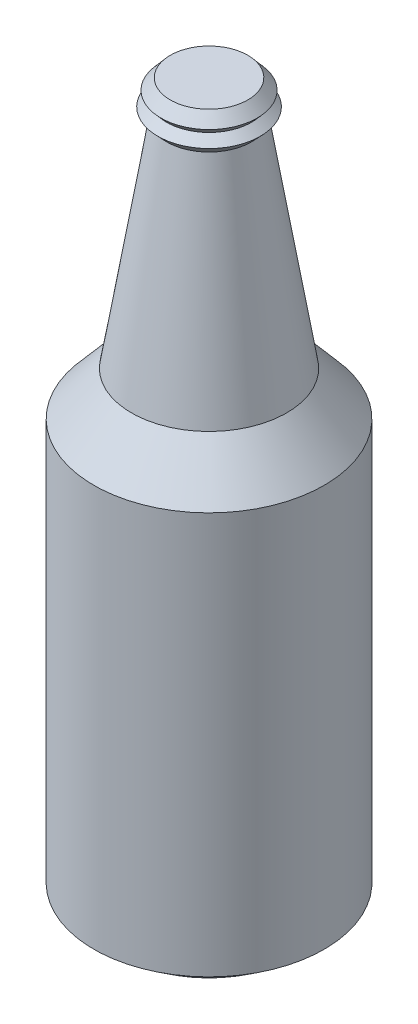
ISO-10303-21;
HEADER;
FILE_DESCRIPTION(('STEP AP214'),'2;1');
FILE_NAME('part.step','',(''),(''),'','','');
FILE_SCHEMA(('AUTOMOTIVE_DESIGN { 1 0 10303 214 1 1 1 1 }'));
ENDSEC;
DATA;
#1=APPLICATION_CONTEXT('core data for automotive mechanical design processes');
#2=APPLICATION_PROTOCOL_DEFINITION('international standard','automotive_design',2000,#1);
#3=PRODUCT_CONTEXT('',#1,'mechanical');
#4=PRODUCT('Part','Part','',(#3));
#5=PRODUCT_RELATED_PRODUCT_CATEGORY('part','',(#4));
#6=PRODUCT_DEFINITION_FORMATION('','',#4);
#7=PRODUCT_DEFINITION_CONTEXT('part definition',#1,'design');
#8=PRODUCT_DEFINITION('design','',#6,#7);
#9=PRODUCT_DEFINITION_SHAPE('','',#8);
#10=(LENGTH_UNIT() NAMED_UNIT(*) SI_UNIT(.MILLI.,.METRE.));
#11=(NAMED_UNIT(*) PLANE_ANGLE_UNIT() SI_UNIT($,.RADIAN.));
#12=(NAMED_UNIT(*) SI_UNIT($,.STERADIAN.) SOLID_ANGLE_UNIT());
#13=UNCERTAINTY_MEASURE_WITH_UNIT(LENGTH_MEASURE(1.E-05),#10,'distance_accuracy_value','');
#14=(GEOMETRIC_REPRESENTATION_CONTEXT(3) GLOBAL_UNCERTAINTY_ASSIGNED_CONTEXT((#13)) GLOBAL_UNIT_ASSIGNED_CONTEXT((#10,
#11,#12)) REPRESENTATION_CONTEXT('',''));
#15=CARTESIAN_POINT('',(0.,0.,0.));
#16=DIRECTION('',(0.,0.,1.));
#17=DIRECTION('',(1.,0.,0.));
#18=AXIS2_PLACEMENT_3D('',#15,#16,#17);
#19=CARTESIAN_POINT('',(-2.1579247158174,95.6271394626163,0.));
#20=DIRECTION('',(0.,1.,0.));
#21=DIRECTION('',(0.,0.,1.));
#22=AXIS2_PLACEMENT_3D('',#19,#20,#21);
#23=PLANE('',#22);
#24=CARTESIAN_POINT('',(-2.1579247158174,95.6271394626163,0.));
#25=DIRECTION('',(0.,-1.,0.));
#26=DIRECTION('',(0.,0.,-1.));
#27=AXIS2_PLACEMENT_3D('',#24,#25,#26);
#28=CIRCLE('',#27,4.42370227652213);
#29=CARTESIAN_POINT('',(-2.1579247158174,95.6271394626163,-4.42370227652213));
#30=VERTEX_POINT('',#29);
#31=EDGE_CURVE('E10',#30,#30,#28,.T.);
#32=ORIENTED_EDGE('',*,*,#31,.F.);
#33=EDGE_LOOP('',(#32));
#34=FACE_BOUND('',#33,.T.);
#35=ADVANCED_FACE('F31',(#34),#23,.T.);
#36=CARTESIAN_POINT('',(-2.1579247158174,94.3744396495262,0.));
#37=DIRECTION('',(0.,-1.,0.));
#38=DIRECTION('',(0.,0.,-1.));
#39=AXIS2_PLACEMENT_3D('',#36,#37,#38);
#40=CONICAL_SURFACE('',#39,5.49695975159178,0.708402938754534);
#41=ORIENTED_EDGE('',*,*,#31,.T.);
#42=EDGE_LOOP('',(#41));
#43=FACE_BOUND('',#42,.T.);
#44=CARTESIAN_POINT('',(-2.1579247158174,94.3744396495262,0.));
#45=DIRECTION('',(0.,-1.,0.));
#46=DIRECTION('',(0.,0.,-1.));
#47=AXIS2_PLACEMENT_3D('',#44,#45,#46);
#48=CIRCLE('',#47,5.49695975159178);
#49=CARTESIAN_POINT('',(-2.1579247158174,94.3744396495262,-5.49695975159178));
#50=VERTEX_POINT('',#49);
#51=EDGE_CURVE('E37',#50,#50,#48,.T.);
#52=ORIENTED_EDGE('',*,*,#51,.F.);
#53=EDGE_LOOP('',(#52));
#54=FACE_BOUND('',#53,.T.);
#55=ADVANCED_FACE('F82',(#43,#54),#40,.T.);
#56=CARTESIAN_POINT('',(-2.1579247158174,93.6175838136878,0.));
#57=DIRECTION('',(0.,1.,0.));
#58=DIRECTION('',(0.,0.,1.));
#59=AXIS2_PLACEMENT_3D('',#56,#57,#58);
#60=CONICAL_SURFACE('',#59,4.83713671521987,0.717011819806879);
#61=ORIENTED_EDGE('',*,*,#51,.T.);
#62=EDGE_LOOP('',(#61));
#63=FACE_BOUND('',#62,.T.);
#64=CARTESIAN_POINT('',(-2.1579247158174,93.6175838136878,0.));
#65=DIRECTION('',(0.,-1.,0.));
#66=DIRECTION('',(0.,0.,-1.));
#67=AXIS2_PLACEMENT_3D('',#64,#65,#66);
#68=CIRCLE('',#67,4.83713671521987);
#69=CARTESIAN_POINT('',(-2.1579247158174,93.6175838136878,-4.83713671521987));
#70=VERTEX_POINT('',#69);
#71=EDGE_CURVE('E41',#70,#70,#68,.T.);
#72=ORIENTED_EDGE('',*,*,#71,.F.);
#73=EDGE_LOOP('',(#72));
#74=FACE_BOUND('',#73,.T.);
#75=ADVANCED_FACE('F87',(#63,#74),#60,.T.);
#76=CARTESIAN_POINT('',(-2.1579247158174,92.7409538157428,0.));
#77=DIRECTION('',(0.,-1.,0.));
#78=DIRECTION('',(0.,0.,-1.));
#79=AXIS2_PLACEMENT_3D('',#76,#77,#78);
#80=CONICAL_SURFACE('',#79,5.84268288933333,0.853784506988017);
#81=ORIENTED_EDGE('',*,*,#71,.T.);
#82=EDGE_LOOP('',(#81));
#83=FACE_BOUND('',#82,.T.);
#84=CARTESIAN_POINT('',(-2.1579247158174,92.7409538157428,0.));
#85=DIRECTION('',(0.,-1.,0.));
#86=DIRECTION('',(0.,0.,-1.));
#87=AXIS2_PLACEMENT_3D('',#84,#85,#86);
#88=CIRCLE('',#87,5.84268288933333);
#89=CARTESIAN_POINT('',(-2.1579247158174,92.7409538157428,-5.84268288933333));
#90=VERTEX_POINT('',#89);
#91=EDGE_CURVE('E45',#90,#90,#88,.T.);
#92=ORIENTED_EDGE('',*,*,#91,.F.);
#93=EDGE_LOOP('',(#92));
#94=FACE_BOUND('',#93,.T.);
#95=ADVANCED_FACE('F91',(#83,#94),#80,.T.);
#96=CARTESIAN_POINT('',(-2.1579247158174,91.6825093494874,0.));
#97=DIRECTION('',(0.,1.,0.));
#98=DIRECTION('',(0.,0.,1.));
#99=AXIS2_PLACEMENT_3D('',#96,#97,#98);
#100=CONICAL_SURFACE('',#99,4.83713671521987,0.759774638975862);
#101=ORIENTED_EDGE('',*,*,#91,.T.);
#102=EDGE_LOOP('',(#101));
#103=FACE_BOUND('',#102,.T.);
#104=CARTESIAN_POINT('',(-2.1579247158174,91.6825093494874,0.));
#105=DIRECTION('',(0.,-1.,0.));
#106=DIRECTION('',(0.,0.,-1.));
#107=AXIS2_PLACEMENT_3D('',#104,#105,#106);
#108=CIRCLE('',#107,4.83713671521987);
#109=CARTESIAN_POINT('',(-2.1579247158174,91.6825093494874,-4.83713671521987));
#110=VERTEX_POINT('',#109);
#111=EDGE_CURVE('E50',#110,#110,#108,.T.);
#112=ORIENTED_EDGE('',*,*,#111,.F.);
#113=EDGE_LOOP('',(#112));
#114=FACE_BOUND('',#113,.T.);
#115=ADVANCED_FACE('F97',(#103,#114),#100,.T.);
#116=CARTESIAN_POINT('',(-2.1579247158174,66.8968754066142,0.));
#117=DIRECTION('',(0.,-1.,0.));
#118=DIRECTION('',(0.,0.,-1.));
#119=AXIS2_PLACEMENT_3D('',#116,#117,#118);
#120=CONICAL_SURFACE('',#119,8.85889996181879,0.16085988954248);
#121=ORIENTED_EDGE('',*,*,#111,.T.);
#122=EDGE_LOOP('',(#121));
#123=FACE_BOUND('',#122,.T.);
#124=CARTESIAN_POINT('',(-2.1579247158174,66.8968754066142,0.));
#125=DIRECTION('',(0.,-1.,0.));
#126=DIRECTION('',(0.,0.,-1.));
#127=AXIS2_PLACEMENT_3D('',#124,#125,#126);
#128=CIRCLE('',#127,8.85889996181879);
#129=CARTESIAN_POINT('',(-2.1579247158174,66.8968754066142,-8.85889996181879));
#130=VERTEX_POINT('',#129);
#131=EDGE_CURVE('E53',#130,#130,#128,.T.);
#132=ORIENTED_EDGE('',*,*,#131,.F.);
#133=EDGE_LOOP('',(#132));
#134=FACE_BOUND('',#133,.T.);
#135=ADVANCED_FACE('F101',(#123,#134),#120,.T.);
#136=CARTESIAN_POINT('',(-2.1579247158174,61.8866371598127,0.));
#137=DIRECTION('',(0.,-1.,0.));
#138=DIRECTION('',(0.,0.,-1.));
#139=AXIS2_PLACEMENT_3D('',#136,#137,#138);
#140=CONICAL_SURFACE('',#139,13.1514492174902,0.708402938754534);
#141=ORIENTED_EDGE('',*,*,#131,.T.);
#142=EDGE_LOOP('',(#141));
#143=FACE_BOUND('',#142,.T.);
#144=CARTESIAN_POINT('',(-2.1579247158174,61.8866371598127,0.));
#145=DIRECTION('',(0.,-1.,0.));
#146=DIRECTION('',(0.,0.,-1.));
#147=AXIS2_PLACEMENT_3D('',#144,#145,#146);
#148=CIRCLE('',#147,13.1514492174902);
#149=CARTESIAN_POINT('',(-2.1579247158174,61.8866371598127,-13.1514492174902));
#150=VERTEX_POINT('',#149);
#151=EDGE_CURVE('E56',#150,#150,#148,.T.);
#152=ORIENTED_EDGE('',*,*,#151,.F.);
#153=EDGE_LOOP('',(#152));
#154=FACE_BOUND('',#153,.T.);
#155=ADVANCED_FACE('F78',(#143,#154),#140,.T.);
#156=CARTESIAN_POINT('',(-2.1579247158174,14.6353989586562,0.));
#157=DIRECTION('',(0.,-1.,0.));
#158=DIRECTION('',(0.,0.,-1.));
#159=AXIS2_PLACEMENT_3D('',#156,#157,#158);
#160=CYLINDRICAL_SURFACE('',#159,13.1514492174902);
#161=ORIENTED_EDGE('',*,*,#151,.T.);
#162=EDGE_LOOP('',(#161));
#163=FACE_BOUND('',#162,.T.);
#164=CARTESIAN_POINT('',(-2.1579247158174,16.006240693717,0.));
#165=DIRECTION('',(0.,-1.,0.));
#166=DIRECTION('',(0.,0.,-1.));
#167=AXIS2_PLACEMENT_3D('',#164,#165,#166);
#168=CIRCLE('',#167,13.1514492174902);
#169=CARTESIAN_POINT('',(-2.1579247158174,16.006240693717,-13.1514492174902));
#170=VERTEX_POINT('',#169);
#171=EDGE_CURVE('E59',#170,#170,#168,.T.);
#172=ORIENTED_EDGE('',*,*,#171,.F.);
#173=EDGE_LOOP('',(#172));
#174=FACE_BOUND('',#173,.T.);
#175=ADVANCED_FACE('F70',(#163,#174),#160,.T.);
#176=CARTESIAN_POINT('',(-2.1579247158174,13.6159046731692,0.));
#177=DIRECTION('',(0.,1.,0.));
#178=DIRECTION('',(0.,0.,1.));
#179=AXIS2_PLACEMENT_3D('',#176,#177,#178);
#180=CONICAL_SURFACE('',#179,9.92589285581438,0.933040367827676);
#181=ORIENTED_EDGE('',*,*,#171,.T.);
#182=EDGE_LOOP('',(#181));
#183=FACE_BOUND('',#182,.T.);
#184=CARTESIAN_POINT('',(-2.1579247158174,13.6159046731692,0.));
#185=DIRECTION('',(0.,-1.,0.));
#186=DIRECTION('',(0.,0.,-1.));
#187=AXIS2_PLACEMENT_3D('',#184,#185,#186);
#188=CIRCLE('',#187,9.92589285581438);
#189=CARTESIAN_POINT('',(-2.1579247158174,13.6159046731692,-9.92589285581438));
#190=VERTEX_POINT('',#189);
#191=EDGE_CURVE('E62',#190,#190,#188,.T.);
#192=ORIENTED_EDGE('',*,*,#191,.F.);
#193=EDGE_LOOP('',(#192));
#194=FACE_BOUND('',#193,.T.);
#195=ADVANCED_FACE('F68',(#183,#194),#180,.T.);
#196=CARTESIAN_POINT('',(7.76796813999699,13.6159046731692,0.));
#197=DIRECTION('',(0.,-1.,0.));
#198=DIRECTION('',(0.,0.,-1.));
#199=AXIS2_PLACEMENT_3D('',#196,#197,#198);
#200=PLANE('',#199);
#201=ORIENTED_EDGE('',*,*,#191,.T.);
#202=EDGE_LOOP('',(#201));
#203=FACE_BOUND('',#202,.T.);
#204=ADVANCED_FACE('F66',(#203),#200,.T.);
#205=CLOSED_SHELL('',(#35,#55,#75,#95,#115,#135,#155,#175,#195,#204));
#206=MANIFOLD_SOLID_BREP('B2',#205);
#207=ADVANCED_BREP_SHAPE_REPRESENTATION('',(#18,#206),#14);
#208=SHAPE_DEFINITION_REPRESENTATION(#9,#207);
ENDSEC;
END-ISO-10303-21;
